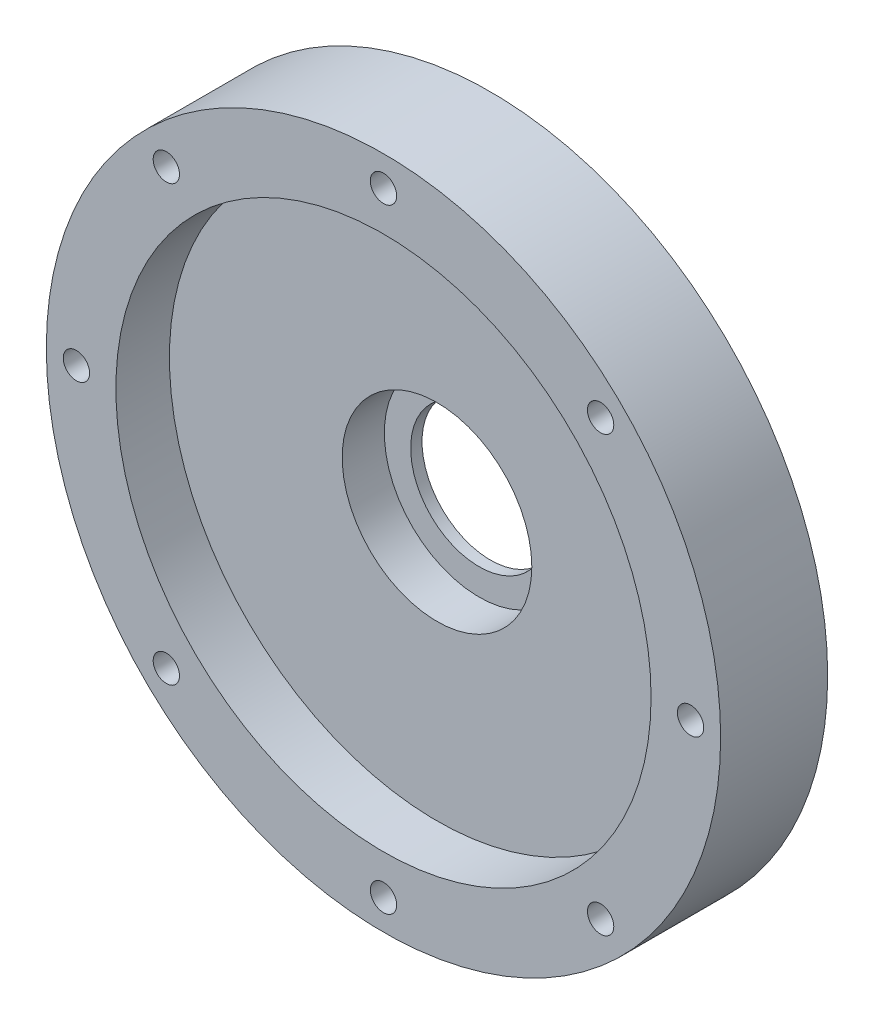
ISO-10303-21;
HEADER;
FILE_DESCRIPTION(('STEP AP214'),'2;1');
FILE_NAME('part.step','',(''),(''),'','','');
FILE_SCHEMA(('AUTOMOTIVE_DESIGN { 1 0 10303 214 1 1 1 1 }'));
ENDSEC;
DATA;
#1=APPLICATION_CONTEXT('core data for automotive mechanical design processes');
#2=APPLICATION_PROTOCOL_DEFINITION('international standard','automotive_design',2000,#1);
#3=PRODUCT_CONTEXT('',#1,'mechanical');
#4=PRODUCT('Part','Part','',(#3));
#5=PRODUCT_RELATED_PRODUCT_CATEGORY('part','',(#4));
#6=PRODUCT_DEFINITION_FORMATION('','',#4);
#7=PRODUCT_DEFINITION_CONTEXT('part definition',#1,'design');
#8=PRODUCT_DEFINITION('design','',#6,#7);
#9=PRODUCT_DEFINITION_SHAPE('','',#8);
#10=(LENGTH_UNIT() NAMED_UNIT(*) SI_UNIT(.MILLI.,.METRE.));
#11=(NAMED_UNIT(*) PLANE_ANGLE_UNIT() SI_UNIT($,.RADIAN.));
#12=(NAMED_UNIT(*) SI_UNIT($,.STERADIAN.) SOLID_ANGLE_UNIT());
#13=UNCERTAINTY_MEASURE_WITH_UNIT(LENGTH_MEASURE(1.E-05),#10,'distance_accuracy_value','');
#14=(GEOMETRIC_REPRESENTATION_CONTEXT(3) GLOBAL_UNCERTAINTY_ASSIGNED_CONTEXT((#13)) GLOBAL_UNIT_ASSIGNED_CONTEXT((#10,
#11,#12)) REPRESENTATION_CONTEXT('',''));
#15=CARTESIAN_POINT('',(0.,0.,0.));
#16=DIRECTION('',(0.,0.,1.));
#17=DIRECTION('',(1.,0.,0.));
#18=AXIS2_PLACEMENT_3D('',#15,#16,#17);
#19=CARTESIAN_POINT('',(0.,0.,10.16));
#20=DIRECTION('',(0.,0.,-1.));
#21=DIRECTION('',(-1.,0.,0.));
#22=AXIS2_PLACEMENT_3D('',#19,#20,#21);
#23=CYLINDRICAL_SURFACE('',#22,32.004);
#24=CARTESIAN_POINT('',(0.,0.,10.16));
#25=DIRECTION('',(0.,0.,1.));
#26=DIRECTION('',(1.,0.,0.));
#27=AXIS2_PLACEMENT_3D('',#24,#25,#26);
#28=CIRCLE('',#27,32.004);
#29=CARTESIAN_POINT('',(32.004,0.,10.16));
#30=VERTEX_POINT('',#29);
#31=EDGE_CURVE('E10',#30,#30,#28,.T.);
#32=ORIENTED_EDGE('',*,*,#31,.F.);
#33=EDGE_LOOP('',(#32));
#34=FACE_BOUND('',#33,.T.);
#35=CARTESIAN_POINT('',(0.,0.,0.));
#36=DIRECTION('',(0.,0.,1.));
#37=DIRECTION('',(1.,0.,0.));
#38=AXIS2_PLACEMENT_3D('',#35,#36,#37);
#39=CIRCLE('',#38,32.004);
#40=CARTESIAN_POINT('',(32.004,0.,0.));
#41=VERTEX_POINT('',#40);
#42=EDGE_CURVE('E50',#41,#41,#39,.T.);
#43=ORIENTED_EDGE('',*,*,#42,.T.);
#44=EDGE_LOOP('',(#43));
#45=FACE_BOUND('',#44,.T.);
#46=ADVANCED_FACE('F47',(#34,#45),#23,.T.);
#47=CARTESIAN_POINT('',(0.,0.,10.16));
#48=DIRECTION('',(0.,0.,1.));
#49=DIRECTION('',(1.,0.,0.));
#50=AXIS2_PLACEMENT_3D('',#47,#48,#49);
#51=PLANE('',#50);
#52=CARTESIAN_POINT('',(0.,29.1465,10.16));
#53=DIRECTION('',(0.,0.,1.));
#54=DIRECTION('',(1.,0.,0.));
#55=AXIS2_PLACEMENT_3D('',#52,#53,#54);
#56=CIRCLE('',#55,1.25);
#57=CARTESIAN_POINT('',(1.25,29.1465,10.16));
#58=VERTEX_POINT('',#57);
#59=EDGE_CURVE('E144',#58,#58,#56,.T.);
#60=ORIENTED_EDGE('',*,*,#59,.F.);
#61=EDGE_LOOP('',(#60));
#62=FACE_BOUND('',#61,.T.);
#63=CARTESIAN_POINT('',(20.6096877978537,20.6096877978537,10.16));
#64=DIRECTION('',(0.,0.,1.));
#65=DIRECTION('',(1.,0.,0.));
#66=AXIS2_PLACEMENT_3D('',#63,#64,#65);
#67=CIRCLE('',#66,1.25);
#68=CARTESIAN_POINT('',(21.8596877978537,20.6096877978537,10.16));
#69=VERTEX_POINT('',#68);
#70=EDGE_CURVE('E136',#69,#69,#67,.T.);
#71=ORIENTED_EDGE('',*,*,#70,.F.);
#72=EDGE_LOOP('',(#71));
#73=FACE_BOUND('',#72,.T.);
#74=CARTESIAN_POINT('',(29.1465,0.,10.16));
#75=DIRECTION('',(0.,0.,1.));
#76=DIRECTION('',(1.,0.,0.));
#77=AXIS2_PLACEMENT_3D('',#74,#75,#76);
#78=CIRCLE('',#77,1.25);
#79=CARTESIAN_POINT('',(30.3965,0.,10.16));
#80=VERTEX_POINT('',#79);
#81=EDGE_CURVE('E128',#80,#80,#78,.T.);
#82=ORIENTED_EDGE('',*,*,#81,.F.);
#83=EDGE_LOOP('',(#82));
#84=FACE_BOUND('',#83,.T.);
#85=CARTESIAN_POINT('',(20.6096877978537,-20.6096877978537,10.16));
#86=DIRECTION('',(0.,0.,1.));
#87=DIRECTION('',(1.,0.,0.));
#88=AXIS2_PLACEMENT_3D('',#85,#86,#87);
#89=CIRCLE('',#88,1.25);
#90=CARTESIAN_POINT('',(21.8596877978537,-20.6096877978537,10.16));
#91=VERTEX_POINT('',#90);
#92=EDGE_CURVE('E120',#91,#91,#89,.T.);
#93=ORIENTED_EDGE('',*,*,#92,.F.);
#94=EDGE_LOOP('',(#93));
#95=FACE_BOUND('',#94,.T.);
#96=CARTESIAN_POINT('',(0.,-29.1465,10.16));
#97=DIRECTION('',(0.,0.,1.));
#98=DIRECTION('',(1.,0.,0.));
#99=AXIS2_PLACEMENT_3D('',#96,#97,#98);
#100=CIRCLE('',#99,1.25);
#101=CARTESIAN_POINT('',(1.25,-29.1465,10.16));
#102=VERTEX_POINT('',#101);
#103=EDGE_CURVE('E112',#102,#102,#100,.T.);
#104=ORIENTED_EDGE('',*,*,#103,.F.);
#105=EDGE_LOOP('',(#104));
#106=FACE_BOUND('',#105,.T.);
#107=CARTESIAN_POINT('',(-20.6096877978537,-20.6096877978537,10.16));
#108=DIRECTION('',(0.,0.,1.));
#109=DIRECTION('',(1.,0.,0.));
#110=AXIS2_PLACEMENT_3D('',#107,#108,#109);
#111=CIRCLE('',#110,1.25);
#112=CARTESIAN_POINT('',(-19.3596877978537,-20.6096877978537,10.16));
#113=VERTEX_POINT('',#112);
#114=EDGE_CURVE('E104',#113,#113,#111,.T.);
#115=ORIENTED_EDGE('',*,*,#114,.F.);
#116=EDGE_LOOP('',(#115));
#117=FACE_BOUND('',#116,.T.);
#118=CARTESIAN_POINT('',(-29.1465,0.,10.16));
#119=DIRECTION('',(0.,0.,1.));
#120=DIRECTION('',(1.,0.,0.));
#121=AXIS2_PLACEMENT_3D('',#118,#119,#120);
#122=CIRCLE('',#121,1.25);
#123=CARTESIAN_POINT('',(-27.8965,0.,10.16));
#124=VERTEX_POINT('',#123);
#125=EDGE_CURVE('E96',#124,#124,#122,.T.);
#126=ORIENTED_EDGE('',*,*,#125,.F.);
#127=EDGE_LOOP('',(#126));
#128=FACE_BOUND('',#127,.T.);
#129=CARTESIAN_POINT('',(-20.6096877978537,20.6096877978537,10.16));
#130=DIRECTION('',(0.,0.,1.));
#131=DIRECTION('',(1.,0.,0.));
#132=AXIS2_PLACEMENT_3D('',#129,#130,#131);
#133=CIRCLE('',#132,1.25);
#134=CARTESIAN_POINT('',(-19.3596877978537,20.6096877978537,10.16));
#135=VERTEX_POINT('',#134);
#136=EDGE_CURVE('E88',#135,#135,#133,.T.);
#137=ORIENTED_EDGE('',*,*,#136,.F.);
#138=EDGE_LOOP('',(#137));
#139=FACE_BOUND('',#138,.T.);
#140=CARTESIAN_POINT('',(0.,0.,10.16));
#141=DIRECTION('',(0.,0.,1.));
#142=DIRECTION('',(1.,0.,0.));
#143=AXIS2_PLACEMENT_3D('',#140,#141,#142);
#144=CIRCLE('',#143,25.4);
#145=CARTESIAN_POINT('',(25.4,0.,10.16));
#146=VERTEX_POINT('',#145);
#147=EDGE_CURVE('E62',#146,#146,#144,.T.);
#148=ORIENTED_EDGE('',*,*,#147,.F.);
#149=EDGE_LOOP('',(#148));
#150=FACE_BOUND('',#149,.T.);
#151=ORIENTED_EDGE('',*,*,#31,.T.);
#152=EDGE_LOOP('',(#151));
#153=FACE_BOUND('',#152,.T.);
#154=ADVANCED_FACE('F151',(#62,#73,#84,#95,#106,#117,#128,#139,#150,#153),#51,.T.);
#155=CARTESIAN_POINT('',(0.,0.,0.));
#156=DIRECTION('',(0.,0.,1.));
#157=DIRECTION('',(1.,0.,0.));
#158=AXIS2_PLACEMENT_3D('',#155,#156,#157);
#159=PLANE('',#158);
#160=CARTESIAN_POINT('',(0.,29.1465,0.));
#161=DIRECTION('',(0.,0.,1.));
#162=DIRECTION('',(1.,0.,0.));
#163=AXIS2_PLACEMENT_3D('',#160,#161,#162);
#164=CIRCLE('',#163,1.25);
#165=CARTESIAN_POINT('',(1.25,29.1465,0.));
#166=VERTEX_POINT('',#165);
#167=EDGE_CURVE('E140',#166,#166,#164,.T.);
#168=ORIENTED_EDGE('',*,*,#167,.T.);
#169=EDGE_LOOP('',(#168));
#170=FACE_BOUND('',#169,.T.);
#171=CARTESIAN_POINT('',(20.6096877978537,20.6096877978537,0.));
#172=DIRECTION('',(0.,0.,1.));
#173=DIRECTION('',(1.,0.,0.));
#174=AXIS2_PLACEMENT_3D('',#171,#172,#173);
#175=CIRCLE('',#174,1.25);
#176=CARTESIAN_POINT('',(21.8596877978537,20.6096877978537,0.));
#177=VERTEX_POINT('',#176);
#178=EDGE_CURVE('E132',#177,#177,#175,.T.);
#179=ORIENTED_EDGE('',*,*,#178,.T.);
#180=EDGE_LOOP('',(#179));
#181=FACE_BOUND('',#180,.T.);
#182=CARTESIAN_POINT('',(29.1465,0.,0.));
#183=DIRECTION('',(0.,0.,1.));
#184=DIRECTION('',(1.,0.,0.));
#185=AXIS2_PLACEMENT_3D('',#182,#183,#184);
#186=CIRCLE('',#185,1.25);
#187=CARTESIAN_POINT('',(30.3965,0.,0.));
#188=VERTEX_POINT('',#187);
#189=EDGE_CURVE('E124',#188,#188,#186,.T.);
#190=ORIENTED_EDGE('',*,*,#189,.T.);
#191=EDGE_LOOP('',(#190));
#192=FACE_BOUND('',#191,.T.);
#193=CARTESIAN_POINT('',(20.6096877978537,-20.6096877978537,0.));
#194=DIRECTION('',(0.,0.,1.));
#195=DIRECTION('',(1.,0.,0.));
#196=AXIS2_PLACEMENT_3D('',#193,#194,#195);
#197=CIRCLE('',#196,1.25);
#198=CARTESIAN_POINT('',(21.8596877978537,-20.6096877978537,0.));
#199=VERTEX_POINT('',#198);
#200=EDGE_CURVE('E116',#199,#199,#197,.T.);
#201=ORIENTED_EDGE('',*,*,#200,.T.);
#202=EDGE_LOOP('',(#201));
#203=FACE_BOUND('',#202,.T.);
#204=CARTESIAN_POINT('',(0.,-29.1465,0.));
#205=DIRECTION('',(0.,0.,1.));
#206=DIRECTION('',(1.,0.,0.));
#207=AXIS2_PLACEMENT_3D('',#204,#205,#206);
#208=CIRCLE('',#207,1.25);
#209=CARTESIAN_POINT('',(1.25,-29.1465,0.));
#210=VERTEX_POINT('',#209);
#211=EDGE_CURVE('E108',#210,#210,#208,.T.);
#212=ORIENTED_EDGE('',*,*,#211,.T.);
#213=EDGE_LOOP('',(#212));
#214=FACE_BOUND('',#213,.T.);
#215=CARTESIAN_POINT('',(-20.6096877978537,-20.6096877978537,0.));
#216=DIRECTION('',(0.,0.,1.));
#217=DIRECTION('',(1.,0.,0.));
#218=AXIS2_PLACEMENT_3D('',#215,#216,#217);
#219=CIRCLE('',#218,1.25);
#220=CARTESIAN_POINT('',(-19.3596877978537,-20.6096877978537,0.));
#221=VERTEX_POINT('',#220);
#222=EDGE_CURVE('E100',#221,#221,#219,.T.);
#223=ORIENTED_EDGE('',*,*,#222,.T.);
#224=EDGE_LOOP('',(#223));
#225=FACE_BOUND('',#224,.T.);
#226=CARTESIAN_POINT('',(-29.1465,0.,0.));
#227=DIRECTION('',(0.,0.,1.));
#228=DIRECTION('',(1.,0.,0.));
#229=AXIS2_PLACEMENT_3D('',#226,#227,#228);
#230=CIRCLE('',#229,1.25);
#231=CARTESIAN_POINT('',(-27.8965,0.,0.));
#232=VERTEX_POINT('',#231);
#233=EDGE_CURVE('E92',#232,#232,#230,.T.);
#234=ORIENTED_EDGE('',*,*,#233,.T.);
#235=EDGE_LOOP('',(#234));
#236=FACE_BOUND('',#235,.T.);
#237=CARTESIAN_POINT('',(-20.6096877978537,20.6096877978537,0.));
#238=DIRECTION('',(0.,0.,1.));
#239=DIRECTION('',(1.,0.,0.));
#240=AXIS2_PLACEMENT_3D('',#237,#238,#239);
#241=CIRCLE('',#240,1.25);
#242=CARTESIAN_POINT('',(-19.3596877978537,20.6096877978537,0.));
#243=VERTEX_POINT('',#242);
#244=EDGE_CURVE('E81',#243,#243,#241,.T.);
#245=ORIENTED_EDGE('',*,*,#244,.T.);
#246=EDGE_LOOP('',(#245));
#247=FACE_BOUND('',#246,.T.);
#248=CARTESIAN_POINT('',(0.,0.,0.));
#249=DIRECTION('',(0.,0.,1.));
#250=DIRECTION('',(1.,0.,0.));
#251=AXIS2_PLACEMENT_3D('',#248,#249,#250);
#252=CIRCLE('',#251,6.5);
#253=CARTESIAN_POINT('',(6.5,0.,0.));
#254=VERTEX_POINT('',#253);
#255=EDGE_CURVE('E73',#254,#254,#252,.T.);
#256=ORIENTED_EDGE('',*,*,#255,.T.);
#257=EDGE_LOOP('',(#256));
#258=FACE_BOUND('',#257,.T.);
#259=ORIENTED_EDGE('',*,*,#42,.F.);
#260=EDGE_LOOP('',(#259));
#261=FACE_BOUND('',#260,.T.);
#262=ADVANCED_FACE('F154',(#170,#181,#192,#203,#214,#225,#236,#247,#258,#261),#159,.F.);
#263=CARTESIAN_POINT('',(0.,0.,5.08));
#264=DIRECTION('',(0.,0.,1.));
#265=DIRECTION('',(1.,0.,0.));
#266=AXIS2_PLACEMENT_3D('',#263,#264,#265);
#267=CYLINDRICAL_SURFACE('',#266,25.4);
#268=CARTESIAN_POINT('',(0.,0.,5.08));
#269=DIRECTION('',(0.,0.,1.));
#270=DIRECTION('',(1.,0.,0.));
#271=AXIS2_PLACEMENT_3D('',#268,#269,#270);
#272=CIRCLE('',#271,25.4);
#273=CARTESIAN_POINT('',(25.4,0.,5.08));
#274=VERTEX_POINT('',#273);
#275=EDGE_CURVE('E60',#274,#274,#272,.T.);
#276=ORIENTED_EDGE('',*,*,#275,.F.);
#277=EDGE_LOOP('',(#276));
#278=FACE_BOUND('',#277,.T.);
#279=ORIENTED_EDGE('',*,*,#147,.T.);
#280=EDGE_LOOP('',(#279));
#281=FACE_BOUND('',#280,.T.);
#282=ADVANCED_FACE('F172',(#278,#281),#267,.F.);
#283=CARTESIAN_POINT('',(0.,0.,5.08));
#284=DIRECTION('',(0.,0.,1.));
#285=DIRECTION('',(1.,0.,0.));
#286=AXIS2_PLACEMENT_3D('',#283,#284,#285);
#287=PLANE('',#286);
#288=CARTESIAN_POINT('',(0.,0.,5.08));
#289=DIRECTION('',(0.,0.,1.));
#290=DIRECTION('',(1.,0.,0.));
#291=AXIS2_PLACEMENT_3D('',#288,#289,#290);
#292=CIRCLE('',#291,9.);
#293=CARTESIAN_POINT('',(9.,0.,5.08));
#294=VERTEX_POINT('',#293);
#295=EDGE_CURVE('E69',#294,#294,#292,.T.);
#296=ORIENTED_EDGE('',*,*,#295,.F.);
#297=EDGE_LOOP('',(#296));
#298=FACE_BOUND('',#297,.T.);
#299=ORIENTED_EDGE('',*,*,#275,.T.);
#300=EDGE_LOOP('',(#299));
#301=FACE_BOUND('',#300,.T.);
#302=ADVANCED_FACE('F174',(#298,#301),#287,.T.);
#303=CARTESIAN_POINT('',(0.,0.,1.08));
#304=DIRECTION('',(0.,0.,1.));
#305=DIRECTION('',(1.,0.,0.));
#306=AXIS2_PLACEMENT_3D('',#303,#304,#305);
#307=CYLINDRICAL_SURFACE('',#306,9.);
#308=CARTESIAN_POINT('',(0.,0.,1.08));
#309=DIRECTION('',(0.,0.,1.));
#310=DIRECTION('',(1.,0.,0.));
#311=AXIS2_PLACEMENT_3D('',#308,#309,#310);
#312=CIRCLE('',#311,9.);
#313=CARTESIAN_POINT('',(9.,0.,1.08));
#314=VERTEX_POINT('',#313);
#315=EDGE_CURVE('E66',#314,#314,#312,.T.);
#316=ORIENTED_EDGE('',*,*,#315,.F.);
#317=EDGE_LOOP('',(#316));
#318=FACE_BOUND('',#317,.T.);
#319=ORIENTED_EDGE('',*,*,#295,.T.);
#320=EDGE_LOOP('',(#319));
#321=FACE_BOUND('',#320,.T.);
#322=ADVANCED_FACE('F180',(#318,#321),#307,.F.);
#323=CARTESIAN_POINT('',(0.,0.,1.08));
#324=DIRECTION('',(0.,0.,1.));
#325=DIRECTION('',(1.,0.,0.));
#326=AXIS2_PLACEMENT_3D('',#323,#324,#325);
#327=PLANE('',#326);
#328=CARTESIAN_POINT('',(0.,0.,1.08));
#329=DIRECTION('',(0.,0.,1.));
#330=DIRECTION('',(1.,0.,0.));
#331=AXIS2_PLACEMENT_3D('',#328,#329,#330);
#332=CIRCLE('',#331,6.5);
#333=CARTESIAN_POINT('',(6.5,0.,1.08));
#334=VERTEX_POINT('',#333);
#335=EDGE_CURVE('E77',#334,#334,#332,.T.);
#336=ORIENTED_EDGE('',*,*,#335,.F.);
#337=EDGE_LOOP('',(#336));
#338=FACE_BOUND('',#337,.T.);
#339=ORIENTED_EDGE('',*,*,#315,.T.);
#340=EDGE_LOOP('',(#339));
#341=FACE_BOUND('',#340,.T.);
#342=ADVANCED_FACE('F209',(#338,#341),#327,.T.);
#343=CARTESIAN_POINT('',(0.,0.,0.));
#344=DIRECTION('',(0.,0.,1.));
#345=DIRECTION('',(1.,0.,0.));
#346=AXIS2_PLACEMENT_3D('',#343,#344,#345);
#347=CYLINDRICAL_SURFACE('',#346,6.5);
#348=ORIENTED_EDGE('',*,*,#255,.F.);
#349=EDGE_LOOP('',(#348));
#350=FACE_BOUND('',#349,.T.);
#351=ORIENTED_EDGE('',*,*,#335,.T.);
#352=EDGE_LOOP('',(#351));
#353=FACE_BOUND('',#352,.T.);
#354=ADVANCED_FACE('F216',(#350,#353),#347,.F.);
#355=CARTESIAN_POINT('',(-20.6096877978537,20.6096877978537,10.16));
#356=DIRECTION('',(0.,0.,1.));
#357=DIRECTION('',(1.,0.,0.));
#358=AXIS2_PLACEMENT_3D('',#355,#356,#357);
#359=CYLINDRICAL_SURFACE('',#358,1.25);
#360=ORIENTED_EDGE('',*,*,#244,.F.);
#361=EDGE_LOOP('',(#360));
#362=FACE_BOUND('',#361,.T.);
#363=ORIENTED_EDGE('',*,*,#136,.T.);
#364=EDGE_LOOP('',(#363));
#365=FACE_BOUND('',#364,.T.);
#366=ADVANCED_FACE('F242',(#362,#365),#359,.F.);
#367=CARTESIAN_POINT('',(-29.1465,0.,10.16));
#368=DIRECTION('',(0.,0.,1.));
#369=DIRECTION('',(1.,0.,0.));
#370=AXIS2_PLACEMENT_3D('',#367,#368,#369);
#371=CYLINDRICAL_SURFACE('',#370,1.25);
#372=ORIENTED_EDGE('',*,*,#233,.F.);
#373=EDGE_LOOP('',(#372));
#374=FACE_BOUND('',#373,.T.);
#375=ORIENTED_EDGE('',*,*,#125,.T.);
#376=EDGE_LOOP('',(#375));
#377=FACE_BOUND('',#376,.T.);
#378=ADVANCED_FACE('F246',(#374,#377),#371,.F.);
#379=CARTESIAN_POINT('',(-20.6096877978537,-20.6096877978537,10.16));
#380=DIRECTION('',(0.,0.,1.));
#381=DIRECTION('',(1.,0.,0.));
#382=AXIS2_PLACEMENT_3D('',#379,#380,#381);
#383=CYLINDRICAL_SURFACE('',#382,1.25);
#384=ORIENTED_EDGE('',*,*,#222,.F.);
#385=EDGE_LOOP('',(#384));
#386=FACE_BOUND('',#385,.T.);
#387=ORIENTED_EDGE('',*,*,#114,.T.);
#388=EDGE_LOOP('',(#387));
#389=FACE_BOUND('',#388,.T.);
#390=ADVANCED_FACE('F226',(#386,#389),#383,.F.);
#391=CARTESIAN_POINT('',(0.,-29.1465,10.16));
#392=DIRECTION('',(0.,0.,1.));
#393=DIRECTION('',(1.,0.,0.));
#394=AXIS2_PLACEMENT_3D('',#391,#392,#393);
#395=CYLINDRICAL_SURFACE('',#394,1.25);
#396=ORIENTED_EDGE('',*,*,#211,.F.);
#397=EDGE_LOOP('',(#396));
#398=FACE_BOUND('',#397,.T.);
#399=ORIENTED_EDGE('',*,*,#103,.T.);
#400=EDGE_LOOP('',(#399));
#401=FACE_BOUND('',#400,.T.);
#402=ADVANCED_FACE('F222',(#398,#401),#395,.F.);
#403=CARTESIAN_POINT('',(20.6096877978537,-20.6096877978537,10.16));
#404=DIRECTION('',(0.,0.,1.));
#405=DIRECTION('',(1.,0.,0.));
#406=AXIS2_PLACEMENT_3D('',#403,#404,#405);
#407=CYLINDRICAL_SURFACE('',#406,1.25);
#408=ORIENTED_EDGE('',*,*,#200,.F.);
#409=EDGE_LOOP('',(#408));
#410=FACE_BOUND('',#409,.T.);
#411=ORIENTED_EDGE('',*,*,#92,.T.);
#412=EDGE_LOOP('',(#411));
#413=FACE_BOUND('',#412,.T.);
#414=ADVANCED_FACE('F225',(#410,#413),#407,.F.);
#415=CARTESIAN_POINT('',(29.1465,0.,10.16));
#416=DIRECTION('',(0.,0.,1.));
#417=DIRECTION('',(1.,0.,0.));
#418=AXIS2_PLACEMENT_3D('',#415,#416,#417);
#419=CYLINDRICAL_SURFACE('',#418,1.25);
#420=ORIENTED_EDGE('',*,*,#189,.F.);
#421=EDGE_LOOP('',(#420));
#422=FACE_BOUND('',#421,.T.);
#423=ORIENTED_EDGE('',*,*,#81,.T.);
#424=EDGE_LOOP('',(#423));
#425=FACE_BOUND('',#424,.T.);
#426=ADVANCED_FACE('F284',(#422,#425),#419,.F.);
#427=CARTESIAN_POINT('',(20.6096877978537,20.6096877978537,10.16));
#428=DIRECTION('',(0.,0.,1.));
#429=DIRECTION('',(1.,0.,0.));
#430=AXIS2_PLACEMENT_3D('',#427,#428,#429);
#431=CYLINDRICAL_SURFACE('',#430,1.25);
#432=ORIENTED_EDGE('',*,*,#178,.F.);
#433=EDGE_LOOP('',(#432));
#434=FACE_BOUND('',#433,.T.);
#435=ORIENTED_EDGE('',*,*,#70,.T.);
#436=EDGE_LOOP('',(#435));
#437=FACE_BOUND('',#436,.T.);
#438=ADVANCED_FACE('F233',(#434,#437),#431,.F.);
#439=CARTESIAN_POINT('',(0.,29.1465,10.16));
#440=DIRECTION('',(0.,0.,1.));
#441=DIRECTION('',(1.,0.,0.));
#442=AXIS2_PLACEMENT_3D('',#439,#440,#441);
#443=CYLINDRICAL_SURFACE('',#442,1.25);
#444=ORIENTED_EDGE('',*,*,#167,.F.);
#445=EDGE_LOOP('',(#444));
#446=FACE_BOUND('',#445,.T.);
#447=ORIENTED_EDGE('',*,*,#59,.T.);
#448=EDGE_LOOP('',(#447));
#449=FACE_BOUND('',#448,.T.);
#450=ADVANCED_FACE('F149',(#446,#449),#443,.F.);
#451=CLOSED_SHELL('',(#46,#154,#262,#282,#302,#322,#342,#354,#366,#378,#390,#402,#414,#426,#438,#450));
#452=MANIFOLD_SOLID_BREP('B2',#451);
#453=ADVANCED_BREP_SHAPE_REPRESENTATION('',(#18,#452),#14);
#454=SHAPE_DEFINITION_REPRESENTATION(#9,#453);
ENDSEC;
END-ISO-10303-21;
